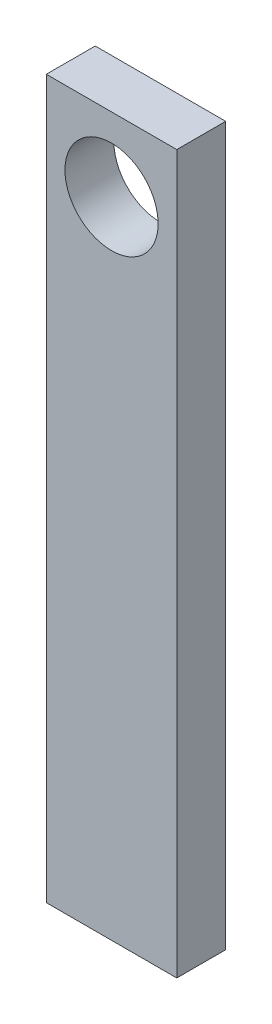
ISO-10303-21;
HEADER;
FILE_DESCRIPTION(('STEP AP214'),'2;1');
FILE_NAME('part.step','',(''),(''),'','','');
FILE_SCHEMA(('AUTOMOTIVE_DESIGN { 1 0 10303 214 1 1 1 1 }'));
ENDSEC;
DATA;
#1=APPLICATION_CONTEXT('core data for automotive mechanical design processes');
#2=APPLICATION_PROTOCOL_DEFINITION('international standard','automotive_design',2000,#1);
#3=PRODUCT_CONTEXT('',#1,'mechanical');
#4=PRODUCT('Part','Part','',(#3));
#5=PRODUCT_RELATED_PRODUCT_CATEGORY('part','',(#4));
#6=PRODUCT_DEFINITION_FORMATION('','',#4);
#7=PRODUCT_DEFINITION_CONTEXT('part definition',#1,'design');
#8=PRODUCT_DEFINITION('design','',#6,#7);
#9=PRODUCT_DEFINITION_SHAPE('','',#8);
#10=(LENGTH_UNIT() NAMED_UNIT(*) SI_UNIT(.MILLI.,.METRE.));
#11=(NAMED_UNIT(*) PLANE_ANGLE_UNIT() SI_UNIT($,.RADIAN.));
#12=(NAMED_UNIT(*) SI_UNIT($,.STERADIAN.) SOLID_ANGLE_UNIT());
#13=UNCERTAINTY_MEASURE_WITH_UNIT(LENGTH_MEASURE(1.E-05),#10,'distance_accuracy_value','');
#14=(GEOMETRIC_REPRESENTATION_CONTEXT(3) GLOBAL_UNCERTAINTY_ASSIGNED_CONTEXT((#13)) GLOBAL_UNIT_ASSIGNED_CONTEXT((#10,
#11,#12)) REPRESENTATION_CONTEXT('',''));
#15=CARTESIAN_POINT('',(0.,0.,0.));
#16=DIRECTION('',(0.,0.,1.));
#17=DIRECTION('',(1.,0.,0.));
#18=AXIS2_PLACEMENT_3D('',#15,#16,#17);
#19=CARTESIAN_POINT('',(20.,190.,-15.));
#20=DIRECTION('',(0.,0.,-1.));
#21=DIRECTION('',(0.,1.,0.));
#22=AXIS2_PLACEMENT_3D('',#19,#20,#21);
#23=PLANE('',#22);
#24=CARTESIAN_POINT('',(0.,167.443589790931,-15.));
#25=DIRECTION('',(0.,0.,-1.));
#26=DIRECTION('',(-1.,0.,0.));
#27=AXIS2_PLACEMENT_3D('',#24,#25,#26);
#28=CIRCLE('',#27,14.2875);
#29=CARTESIAN_POINT('',(-14.2875,167.443589790931,-15.));
#30=VERTEX_POINT('',#29);
#31=EDGE_CURVE('E91',#30,#30,#28,.T.);
#32=ORIENTED_EDGE('',*,*,#31,.F.);
#33=EDGE_LOOP('',(#32));
#34=FACE_BOUND('',#33,.T.);
#35=DIRECTION('',(-1.,0.,0.));
#36=VECTOR('',#35,1.);
#37=CARTESIAN_POINT('',(20.,-30.,-15.));
#38=LINE('',#37,#36);
#39=CARTESIAN_POINT('',(20.,-30.,-15.));
#40=VERTEX_POINT('',#39);
#41=CARTESIAN_POINT('',(-20.,-30.,-15.));
#42=VERTEX_POINT('',#41);
#43=EDGE_CURVE('E36',#40,#42,#38,.T.);
#44=ORIENTED_EDGE('',*,*,#43,.T.);
#45=DIRECTION('',(0.,-1.,0.));
#46=VECTOR('',#45,1.);
#47=CARTESIAN_POINT('',(-20.,190.,-15.));
#48=LINE('',#47,#46);
#49=CARTESIAN_POINT('',(-20.,190.,-15.));
#50=VERTEX_POINT('',#49);
#51=EDGE_CURVE('E73',#50,#42,#48,.T.);
#52=ORIENTED_EDGE('',*,*,#51,.F.);
#53=DIRECTION('',(-1.,0.,0.));
#54=VECTOR('',#53,1.);
#55=CARTESIAN_POINT('',(20.,190.,-15.));
#56=LINE('',#55,#54);
#57=CARTESIAN_POINT('',(20.,190.,-15.));
#58=VERTEX_POINT('',#57);
#59=EDGE_CURVE('E11',#58,#50,#56,.T.);
#60=ORIENTED_EDGE('',*,*,#59,.F.);
#61=DIRECTION('',(0.,-1.,0.));
#62=VECTOR('',#61,1.);
#63=CARTESIAN_POINT('',(20.,190.,-15.));
#64=LINE('',#63,#62);
#65=EDGE_CURVE('E74',#58,#40,#64,.T.);
#66=ORIENTED_EDGE('',*,*,#65,.T.);
#67=EDGE_LOOP('',(#44,#52,#60,#66));
#68=FACE_BOUND('',#67,.T.);
#69=ADVANCED_FACE('F33',(#34,#68),#23,.T.);
#70=CARTESIAN_POINT('',(20.,190.,-15.));
#71=DIRECTION('',(0.,1.,0.));
#72=DIRECTION('',(0.,0.,1.));
#73=AXIS2_PLACEMENT_3D('',#70,#71,#72);
#74=PLANE('',#73);
#75=ORIENTED_EDGE('',*,*,#59,.T.);
#76=DIRECTION('',(0.,0.,-1.));
#77=VECTOR('',#76,1.);
#78=CARTESIAN_POINT('',(-20.,190.,-15.));
#79=LINE('',#78,#77);
#80=CARTESIAN_POINT('',(-20.,190.,0.));
#81=VERTEX_POINT('',#80);
#82=EDGE_CURVE('E90',#81,#50,#79,.T.);
#83=ORIENTED_EDGE('',*,*,#82,.F.);
#84=DIRECTION('',(-1.,0.,0.));
#85=VECTOR('',#84,1.);
#86=CARTESIAN_POINT('',(20.,190.,0.));
#87=LINE('',#86,#85);
#88=CARTESIAN_POINT('',(20.,190.,0.));
#89=VERTEX_POINT('',#88);
#90=EDGE_CURVE('E41',#89,#81,#87,.T.);
#91=ORIENTED_EDGE('',*,*,#90,.F.);
#92=DIRECTION('',(0.,0.,-1.));
#93=VECTOR('',#92,1.);
#94=CARTESIAN_POINT('',(20.,190.,-15.));
#95=LINE('',#94,#93);
#96=EDGE_CURVE('E79',#89,#58,#95,.T.);
#97=ORIENTED_EDGE('',*,*,#96,.T.);
#98=EDGE_LOOP('',(#75,#83,#91,#97));
#99=FACE_BOUND('',#98,.T.);
#100=ADVANCED_FACE('F110',(#99),#74,.T.);
#101=CARTESIAN_POINT('',(20.,190.,0.));
#102=DIRECTION('',(0.,0.,1.));
#103=DIRECTION('',(0.,-1.,0.));
#104=AXIS2_PLACEMENT_3D('',#101,#102,#103);
#105=PLANE('',#104);
#106=CARTESIAN_POINT('',(0.,167.443589790931,0.));
#107=DIRECTION('',(0.,0.,1.));
#108=DIRECTION('',(0.,-1.,0.));
#109=AXIS2_PLACEMENT_3D('',#106,#107,#108);
#110=CIRCLE('',#109,14.2875);
#111=CARTESIAN_POINT('',(0.,153.156089790931,0.));
#112=VERTEX_POINT('',#111);
#113=EDGE_CURVE('E94',#112,#112,#110,.F.);
#114=ORIENTED_EDGE('',*,*,#113,.T.);
#115=EDGE_LOOP('',(#114));
#116=FACE_BOUND('',#115,.T.);
#117=ORIENTED_EDGE('',*,*,#90,.T.);
#118=DIRECTION('',(0.,1.,0.));
#119=VECTOR('',#118,1.);
#120=CARTESIAN_POINT('',(-20.,190.,0.));
#121=LINE('',#120,#119);
#122=CARTESIAN_POINT('',(-20.,-30.,0.));
#123=VERTEX_POINT('',#122);
#124=EDGE_CURVE('E86',#123,#81,#121,.T.);
#125=ORIENTED_EDGE('',*,*,#124,.F.);
#126=DIRECTION('',(-1.,0.,0.));
#127=VECTOR('',#126,1.);
#128=CARTESIAN_POINT('',(20.,-30.,0.));
#129=LINE('',#128,#127);
#130=CARTESIAN_POINT('',(20.,-30.,0.));
#131=VERTEX_POINT('',#130);
#132=EDGE_CURVE('E78',#131,#123,#129,.T.);
#133=ORIENTED_EDGE('',*,*,#132,.F.);
#134=DIRECTION('',(0.,1.,0.));
#135=VECTOR('',#134,1.);
#136=CARTESIAN_POINT('',(20.,190.,0.));
#137=LINE('',#136,#135);
#138=EDGE_CURVE('E103',#131,#89,#137,.T.);
#139=ORIENTED_EDGE('',*,*,#138,.T.);
#140=EDGE_LOOP('',(#117,#125,#133,#139));
#141=FACE_BOUND('',#140,.T.);
#142=ADVANCED_FACE('F107',(#116,#141),#105,.T.);
#143=CARTESIAN_POINT('',(20.,-30.,-15.));
#144=DIRECTION('',(0.,-1.,0.));
#145=DIRECTION('',(0.,0.,-1.));
#146=AXIS2_PLACEMENT_3D('',#143,#144,#145);
#147=PLANE('',#146);
#148=ORIENTED_EDGE('',*,*,#132,.T.);
#149=DIRECTION('',(0.,0.,1.));
#150=VECTOR('',#149,1.);
#151=CARTESIAN_POINT('',(-20.,-30.,-15.));
#152=LINE('',#151,#150);
#153=EDGE_CURVE('E81',#42,#123,#152,.T.);
#154=ORIENTED_EDGE('',*,*,#153,.F.);
#155=ORIENTED_EDGE('',*,*,#43,.F.);
#156=DIRECTION('',(0.,0.,1.));
#157=VECTOR('',#156,1.);
#158=CARTESIAN_POINT('',(20.,-30.,-15.));
#159=LINE('',#158,#157);
#160=EDGE_CURVE('E101',#40,#131,#159,.T.);
#161=ORIENTED_EDGE('',*,*,#160,.T.);
#162=EDGE_LOOP('',(#148,#154,#155,#161));
#163=FACE_BOUND('',#162,.T.);
#164=ADVANCED_FACE('F82',(#163),#147,.T.);
#165=CARTESIAN_POINT('',(20.,0.,0.));
#166=DIRECTION('',(-1.,0.,0.));
#167=DIRECTION('',(0.,0.,1.));
#168=AXIS2_PLACEMENT_3D('',#165,#166,#167);
#169=PLANE('',#168);
#170=ORIENTED_EDGE('',*,*,#65,.F.);
#171=ORIENTED_EDGE('',*,*,#96,.F.);
#172=ORIENTED_EDGE('',*,*,#138,.F.);
#173=ORIENTED_EDGE('',*,*,#160,.F.);
#174=EDGE_LOOP('',(#170,#171,#172,#173));
#175=FACE_BOUND('',#174,.T.);
#176=ADVANCED_FACE('F112',(#175),#169,.F.);
#177=CARTESIAN_POINT('',(-20.,0.,0.));
#178=DIRECTION('',(-1.,0.,0.));
#179=DIRECTION('',(0.,0.,1.));
#180=AXIS2_PLACEMENT_3D('',#177,#178,#179);
#181=PLANE('',#180);
#182=ORIENTED_EDGE('',*,*,#51,.T.);
#183=ORIENTED_EDGE('',*,*,#153,.T.);
#184=ORIENTED_EDGE('',*,*,#124,.T.);
#185=ORIENTED_EDGE('',*,*,#82,.T.);
#186=EDGE_LOOP('',(#182,#183,#184,#185));
#187=FACE_BOUND('',#186,.T.);
#188=ADVANCED_FACE('F89',(#187),#181,.T.);
#189=CARTESIAN_POINT('',(0.,167.443589790931,0.00100000000000794));
#190=DIRECTION('',(0.,0.,-1.));
#191=DIRECTION('',(-1.,0.,0.));
#192=AXIS2_PLACEMENT_3D('',#189,#190,#191);
#193=CYLINDRICAL_SURFACE('',#192,14.2875);
#194=ORIENTED_EDGE('',*,*,#113,.F.);
#195=EDGE_LOOP('',(#194));
#196=FACE_BOUND('',#195,.T.);
#197=ORIENTED_EDGE('',*,*,#31,.T.);
#198=EDGE_LOOP('',(#197));
#199=FACE_BOUND('',#198,.T.);
#200=ADVANCED_FACE('F119',(#196,#199),#193,.F.);
#201=CLOSED_SHELL('',(#69,#100,#142,#164,#176,#188,#200));
#202=MANIFOLD_SOLID_BREP('B2',#201);
#203=ADVANCED_BREP_SHAPE_REPRESENTATION('',(#18,#202),#14);
#204=SHAPE_DEFINITION_REPRESENTATION(#9,#203);
ENDSEC;
END-ISO-10303-21;
